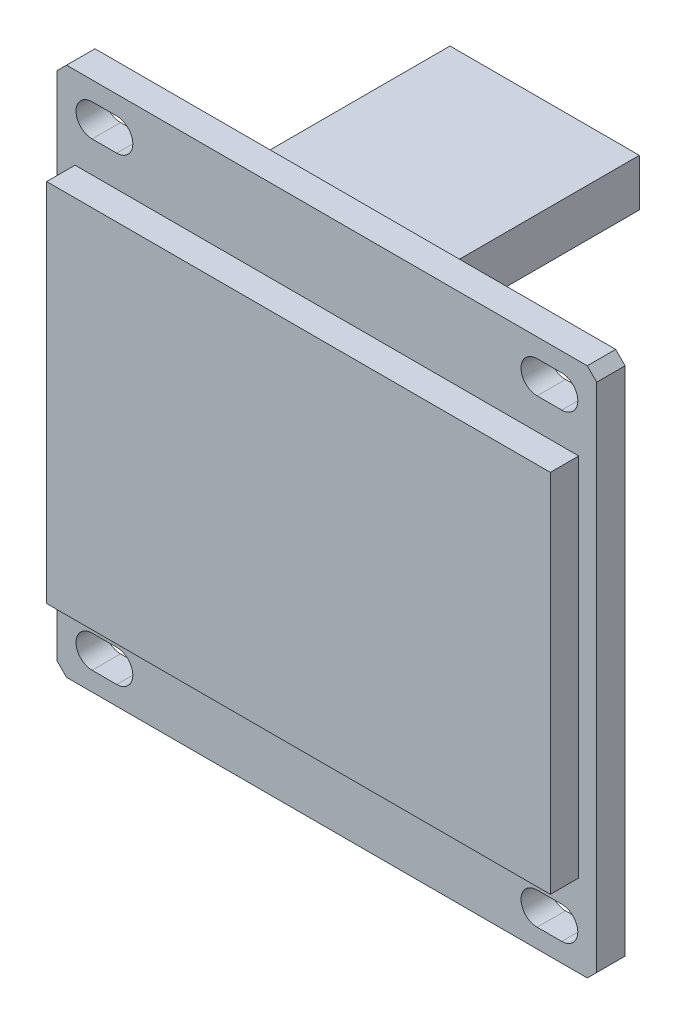
ISO-10303-21;
HEADER;
FILE_DESCRIPTION(('STEP AP214'),'2;1');
FILE_NAME('part.step','',(''),(''),'','','');
FILE_SCHEMA(('AUTOMOTIVE_DESIGN { 1 0 10303 214 1 1 1 1 }'));
ENDSEC;
DATA;
#1=APPLICATION_CONTEXT('core data for automotive mechanical design processes');
#2=APPLICATION_PROTOCOL_DEFINITION('international standard','automotive_design',2000,#1);
#3=PRODUCT_CONTEXT('',#1,'mechanical');
#4=PRODUCT('Part','Part','',(#3));
#5=PRODUCT_RELATED_PRODUCT_CATEGORY('part','',(#4));
#6=PRODUCT_DEFINITION_FORMATION('','',#4);
#7=PRODUCT_DEFINITION_CONTEXT('part definition',#1,'design');
#8=PRODUCT_DEFINITION('design','',#6,#7);
#9=PRODUCT_DEFINITION_SHAPE('','',#8);
#10=(LENGTH_UNIT() NAMED_UNIT(*) SI_UNIT(.MILLI.,.METRE.));
#11=(NAMED_UNIT(*) PLANE_ANGLE_UNIT() SI_UNIT($,.RADIAN.));
#12=(NAMED_UNIT(*) SI_UNIT($,.STERADIAN.) SOLID_ANGLE_UNIT());
#13=UNCERTAINTY_MEASURE_WITH_UNIT(LENGTH_MEASURE(1.E-05),#10,'distance_accuracy_value','');
#14=(GEOMETRIC_REPRESENTATION_CONTEXT(3) GLOBAL_UNCERTAINTY_ASSIGNED_CONTEXT((#13)) GLOBAL_UNIT_ASSIGNED_CONTEXT((#10,
#11,#12)) REPRESENTATION_CONTEXT('',''));
#15=CARTESIAN_POINT('',(0.,0.,0.));
#16=DIRECTION('',(0.,0.,1.));
#17=DIRECTION('',(1.,0.,0.));
#18=AXIS2_PLACEMENT_3D('',#15,#16,#17);
#19=CARTESIAN_POINT('',(0.,0.,0.));
#20=DIRECTION('',(0.,0.,-1.));
#21=DIRECTION('',(-1.,0.,0.));
#22=AXIS2_PLACEMENT_3D('',#19,#20,#21);
#23=PLANE('',#22);
#24=DIRECTION('',(-0.707106781186545,-0.70710678118655,0.));
#25=VECTOR('',#24,1.);
#26=CARTESIAN_POINT('',(-29.4344801548384,-36.0074440446685,0.));
#27=LINE('',#26,#25);
#28=CARTESIAN_POINT('',(-28.9344801548384,-35.5074440446685,0.));
#29=VERTEX_POINT('',#28);
#30=CARTESIAN_POINT('',(-29.4344801548384,-36.0074440446685,0.));
#31=VERTEX_POINT('',#30);
#32=EDGE_CURVE('E425',#29,#31,#27,.T.);
#33=ORIENTED_EDGE('',*,*,#32,.F.);
#34=DIRECTION('',(-1.,0.,0.));
#35=VECTOR('',#34,1.);
#36=CARTESIAN_POINT('',(-28.9344801548384,-35.5074440446685,0.));
#37=LINE('',#36,#35);
#38=CARTESIAN_POINT('',(-1.43448015483836,-35.5074440446685,0.));
#39=VERTEX_POINT('',#38);
#40=EDGE_CURVE('E430',#39,#29,#37,.T.);
#41=ORIENTED_EDGE('',*,*,#40,.F.);
#42=DIRECTION('',(-0.707106781186547,0.707106781186548,0.));
#43=VECTOR('',#42,1.);
#44=CARTESIAN_POINT('',(-1.43448015483836,-35.5074440446685,0.));
#45=LINE('',#44,#43);
#46=CARTESIAN_POINT('',(-0.934480154838363,-36.0074440446685,0.));
#47=VERTEX_POINT('',#46);
#48=EDGE_CURVE('E457',#47,#39,#45,.T.);
#49=ORIENTED_EDGE('',*,*,#48,.F.);
#50=DIRECTION('',(0.,1.,0.));
#51=VECTOR('',#50,1.);
#52=CARTESIAN_POINT('',(-0.934480154838363,-36.0074440446685,0.));
#53=LINE('',#52,#51);
#54=CARTESIAN_POINT('',(-0.93448015483836,-63.0074440446685,0.));
#55=VERTEX_POINT('',#54);
#56=EDGE_CURVE('E455',#55,#47,#53,.T.);
#57=ORIENTED_EDGE('',*,*,#56,.F.);
#58=DIRECTION('',(0.707106781186548,0.707106781186547,0.));
#59=VECTOR('',#58,1.);
#60=CARTESIAN_POINT('',(-1.43448015483836,-63.5074440446685,0.));
#61=LINE('',#60,#59);
#62=CARTESIAN_POINT('',(-1.43448015483836,-63.5074440446685,0.));
#63=VERTEX_POINT('',#62);
#64=EDGE_CURVE('E453',#63,#55,#61,.T.);
#65=ORIENTED_EDGE('',*,*,#64,.F.);
#66=DIRECTION('',(1.,0.,0.));
#67=VECTOR('',#66,1.);
#68=CARTESIAN_POINT('',(-28.9344801548384,-63.5074440446685,0.));
#69=LINE('',#68,#67);
#70=CARTESIAN_POINT('',(-28.9344801548384,-63.5074440446685,0.));
#71=VERTEX_POINT('',#70);
#72=EDGE_CURVE('E451',#71,#63,#69,.T.);
#73=ORIENTED_EDGE('',*,*,#72,.F.);
#74=DIRECTION('',(0.707106781186547,-0.707106781186547,0.));
#75=VECTOR('',#74,1.);
#76=CARTESIAN_POINT('',(-29.4344801548384,-63.0074440446685,0.));
#77=LINE('',#76,#75);
#78=CARTESIAN_POINT('',(-29.4344801548384,-63.0074440446685,0.));
#79=VERTEX_POINT('',#78);
#80=EDGE_CURVE('E449',#79,#71,#77,.T.);
#81=ORIENTED_EDGE('',*,*,#80,.F.);
#82=DIRECTION('',(0.,-1.,0.));
#83=VECTOR('',#82,1.);
#84=CARTESIAN_POINT('',(-29.4344801548384,-36.0074440446685,0.));
#85=LINE('',#84,#83);
#86=EDGE_CURVE('E447',#31,#79,#85,.T.);
#87=ORIENTED_EDGE('',*,*,#86,.F.);
#88=EDGE_LOOP('',(#33,#41,#49,#57,#65,#73,#81,#87));
#89=FACE_BOUND('',#88,.T.);
#90=DIRECTION('',(-1.,0.,0.));
#91=VECTOR('',#90,1.);
#92=CARTESIAN_POINT('',(-4.08448015483837,-36.5074440446685,0.));
#93=LINE('',#92,#91);
#94=CARTESIAN_POINT('',(-2.78448015483836,-36.5074440446685,0.));
#95=VERTEX_POINT('',#94);
#96=CARTESIAN_POINT('',(-4.08448015483837,-36.5074440446685,0.));
#97=VERTEX_POINT('',#96);
#98=EDGE_CURVE('E398',#95,#97,#93,.T.);
#99=ORIENTED_EDGE('',*,*,#98,.T.);
#100=CARTESIAN_POINT('',(-4.08448015483837,-37.3574440446685,0.));
#101=DIRECTION('',(0.,0.,1.));
#102=DIRECTION('',(1.,0.,0.));
#103=AXIS2_PLACEMENT_3D('',#100,#101,#102);
#104=CIRCLE('',#103,0.849999999999997);
#105=CARTESIAN_POINT('',(-4.08448015483837,-38.2074440446685,0.));
#106=VERTEX_POINT('',#105);
#107=EDGE_CURVE('E394',#97,#106,#104,.T.);
#108=ORIENTED_EDGE('',*,*,#107,.T.);
#109=DIRECTION('',(1.,0.,0.));
#110=VECTOR('',#109,1.);
#111=CARTESIAN_POINT('',(-4.08448015483837,-38.2074440446685,0.));
#112=LINE('',#111,#110);
#113=CARTESIAN_POINT('',(-2.78448015483836,-38.2074440446685,0.));
#114=VERTEX_POINT('',#113);
#115=EDGE_CURVE('E408',#106,#114,#112,.T.);
#116=ORIENTED_EDGE('',*,*,#115,.T.);
#117=CARTESIAN_POINT('',(-2.78448015483836,-37.3574440446685,0.));
#118=DIRECTION('',(0.,0.,1.));
#119=DIRECTION('',(1.,0.,0.));
#120=AXIS2_PLACEMENT_3D('',#117,#118,#119);
#121=CIRCLE('',#120,0.84999999999999);
#122=EDGE_CURVE('E411',#114,#95,#121,.T.);
#123=ORIENTED_EDGE('',*,*,#122,.T.);
#124=EDGE_LOOP('',(#99,#108,#116,#123));
#125=FACE_BOUND('',#124,.T.);
#126=DIRECTION('',(-1.,0.,0.));
#127=VECTOR('',#126,1.);
#128=CARTESIAN_POINT('',(-27.5844801548384,-36.5074440446685,0.));
#129=LINE('',#128,#127);
#130=CARTESIAN_POINT('',(-26.2844801548384,-36.5074440446685,0.));
#131=VERTEX_POINT('',#130);
#132=CARTESIAN_POINT('',(-27.5844801548384,-36.5074440446685,0.));
#133=VERTEX_POINT('',#132);
#134=EDGE_CURVE('E367',#131,#133,#129,.T.);
#135=ORIENTED_EDGE('',*,*,#134,.T.);
#136=CARTESIAN_POINT('',(-27.5844801548384,-37.3574440446685,0.));
#137=DIRECTION('',(0.,0.,1.));
#138=DIRECTION('',(1.,0.,0.));
#139=AXIS2_PLACEMENT_3D('',#136,#137,#138);
#140=CIRCLE('',#139,0.849999999999983);
#141=CARTESIAN_POINT('',(-27.5844801548384,-38.2074440446684,0.));
#142=VERTEX_POINT('',#141);
#143=EDGE_CURVE('E363',#133,#142,#140,.T.);
#144=ORIENTED_EDGE('',*,*,#143,.T.);
#145=DIRECTION('',(1.,0.,0.));
#146=VECTOR('',#145,1.);
#147=CARTESIAN_POINT('',(-27.5844801548384,-38.2074440446684,0.));
#148=LINE('',#147,#146);
#149=CARTESIAN_POINT('',(-26.2844801548384,-38.2074440446684,0.));
#150=VERTEX_POINT('',#149);
#151=EDGE_CURVE('E377',#142,#150,#148,.T.);
#152=ORIENTED_EDGE('',*,*,#151,.T.);
#153=CARTESIAN_POINT('',(-26.2844801548384,-37.3574440446685,0.));
#154=DIRECTION('',(0.,0.,1.));
#155=DIRECTION('',(1.,0.,0.));
#156=AXIS2_PLACEMENT_3D('',#153,#154,#155);
#157=CIRCLE('',#156,0.849999999999983);
#158=EDGE_CURVE('E380',#150,#131,#157,.T.);
#159=ORIENTED_EDGE('',*,*,#158,.T.);
#160=EDGE_LOOP('',(#135,#144,#152,#159));
#161=FACE_BOUND('',#160,.T.);
#162=DIRECTION('',(-1.,0.,0.));
#163=VECTOR('',#162,1.);
#164=CARTESIAN_POINT('',(-27.5844801548383,-60.8074440446684,0.));
#165=LINE('',#164,#163);
#166=CARTESIAN_POINT('',(-26.2844801548384,-60.8074440446684,0.));
#167=VERTEX_POINT('',#166);
#168=CARTESIAN_POINT('',(-27.5844801548383,-60.8074440446684,0.));
#169=VERTEX_POINT('',#168);
#170=EDGE_CURVE('E336',#167,#169,#165,.T.);
#171=ORIENTED_EDGE('',*,*,#170,.T.);
#172=CARTESIAN_POINT('',(-27.5844801548383,-61.6574440446684,0.));
#173=DIRECTION('',(0.,0.,1.));
#174=DIRECTION('',(1.,0.,0.));
#175=AXIS2_PLACEMENT_3D('',#172,#173,#174);
#176=CIRCLE('',#175,0.850000000000024);
#177=CARTESIAN_POINT('',(-27.5844801548383,-62.5074440446685,0.));
#178=VERTEX_POINT('',#177);
#179=EDGE_CURVE('E332',#169,#178,#176,.T.);
#180=ORIENTED_EDGE('',*,*,#179,.T.);
#181=DIRECTION('',(1.,0.,0.));
#182=VECTOR('',#181,1.);
#183=CARTESIAN_POINT('',(-27.5844801548383,-62.5074440446685,0.));
#184=LINE('',#183,#182);
#185=CARTESIAN_POINT('',(-26.2844801548384,-62.5074440446685,0.));
#186=VERTEX_POINT('',#185);
#187=EDGE_CURVE('E346',#178,#186,#184,.T.);
#188=ORIENTED_EDGE('',*,*,#187,.T.);
#189=CARTESIAN_POINT('',(-26.2844801548384,-61.6574440446685,0.));
#190=DIRECTION('',(0.,0.,1.));
#191=DIRECTION('',(1.,0.,0.));
#192=AXIS2_PLACEMENT_3D('',#189,#190,#191);
#193=CIRCLE('',#192,0.850000000000024);
#194=EDGE_CURVE('E349',#186,#167,#193,.T.);
#195=ORIENTED_EDGE('',*,*,#194,.T.);
#196=EDGE_LOOP('',(#171,#180,#188,#195));
#197=FACE_BOUND('',#196,.T.);
#198=DIRECTION('',(-1.,0.,0.));
#199=VECTOR('',#198,1.);
#200=CARTESIAN_POINT('',(-4.08448015483836,-60.8074440446684,0.));
#201=LINE('',#200,#199);
#202=CARTESIAN_POINT('',(-2.78448015483838,-60.8074440446684,0.));
#203=VERTEX_POINT('',#202);
#204=CARTESIAN_POINT('',(-4.08448015483836,-60.8074440446684,0.));
#205=VERTEX_POINT('',#204);
#206=EDGE_CURVE('E305',#203,#205,#201,.T.);
#207=ORIENTED_EDGE('',*,*,#206,.T.);
#208=CARTESIAN_POINT('',(-4.08448015483836,-61.6574440446685,0.));
#209=DIRECTION('',(0.,0.,1.));
#210=DIRECTION('',(1.,0.,0.));
#211=AXIS2_PLACEMENT_3D('',#208,#209,#210);
#212=CIRCLE('',#211,0.850000000000017);
#213=CARTESIAN_POINT('',(-4.08448015483836,-62.5074440446685,0.));
#214=VERTEX_POINT('',#213);
#215=EDGE_CURVE('E301',#205,#214,#212,.T.);
#216=ORIENTED_EDGE('',*,*,#215,.T.);
#217=DIRECTION('',(1.,0.,0.));
#218=VECTOR('',#217,1.);
#219=CARTESIAN_POINT('',(-4.08448015483836,-62.5074440446685,0.));
#220=LINE('',#219,#218);
#221=CARTESIAN_POINT('',(-2.78448015483838,-62.5074440446685,0.));
#222=VERTEX_POINT('',#221);
#223=EDGE_CURVE('E315',#214,#222,#220,.T.);
#224=ORIENTED_EDGE('',*,*,#223,.T.);
#225=CARTESIAN_POINT('',(-2.78448015483838,-61.6574440446685,0.));
#226=DIRECTION('',(0.,0.,1.));
#227=DIRECTION('',(1.,0.,0.));
#228=AXIS2_PLACEMENT_3D('',#225,#226,#227);
#229=CIRCLE('',#228,0.850000000000017);
#230=EDGE_CURVE('E318',#222,#203,#229,.T.);
#231=ORIENTED_EDGE('',*,*,#230,.T.);
#232=EDGE_LOOP('',(#207,#216,#224,#231));
#233=FACE_BOUND('',#232,.T.);
#234=DIRECTION('',(1.,0.,0.));
#235=VECTOR('',#234,1.);
#236=CARTESIAN_POINT('',(-20.1844801548384,-36.0074440446685,0.));
#237=LINE('',#236,#235);
#238=CARTESIAN_POINT('',(-20.1844801548384,-36.0074440446685,0.));
#239=VERTEX_POINT('',#238);
#240=CARTESIAN_POINT('',(-10.1844801548384,-36.0074440446685,0.));
#241=VERTEX_POINT('',#240);
#242=EDGE_CURVE('E858',#239,#241,#237,.T.);
#243=ORIENTED_EDGE('',*,*,#242,.F.);
#244=DIRECTION('',(0.,1.,0.));
#245=VECTOR('',#244,1.);
#246=CARTESIAN_POINT('',(-20.1844801548384,-38.5074440446685,0.));
#247=LINE('',#246,#245);
#248=CARTESIAN_POINT('',(-20.1844801548384,-38.5074440446685,0.));
#249=VERTEX_POINT('',#248);
#250=EDGE_CURVE('E265',#249,#239,#247,.T.);
#251=ORIENTED_EDGE('',*,*,#250,.F.);
#252=DIRECTION('',(-1.,0.,0.));
#253=VECTOR('',#252,1.);
#254=CARTESIAN_POINT('',(-20.1844801548384,-38.5074440446685,0.));
#255=LINE('',#254,#253);
#256=CARTESIAN_POINT('',(-10.1844801548384,-38.5074440446685,0.));
#257=VERTEX_POINT('',#256);
#258=EDGE_CURVE('E261',#257,#249,#255,.T.);
#259=ORIENTED_EDGE('',*,*,#258,.F.);
#260=DIRECTION('',(0.,-1.,0.));
#261=VECTOR('',#260,1.);
#262=CARTESIAN_POINT('',(-10.1844801548384,-38.5074440446685,0.));
#263=LINE('',#262,#261);
#264=EDGE_CURVE('E855',#241,#257,#263,.T.);
#265=ORIENTED_EDGE('',*,*,#264,.F.);
#266=EDGE_LOOP('',(#243,#251,#259,#265));
#267=FACE_BOUND('',#266,.T.);
#268=ADVANCED_FACE('F33',(#89,#125,#161,#197,#233,#267),#23,.T.);
#269=CARTESIAN_POINT('',(0.,0.,1.5));
#270=DIRECTION('',(0.,0.,-1.));
#271=DIRECTION('',(-1.,0.,0.));
#272=AXIS2_PLACEMENT_3D('',#269,#270,#271);
#273=PLANE('',#272);
#274=CARTESIAN_POINT('',(-4.08448015483836,-61.6574440446685,1.5));
#275=DIRECTION('',(0.,0.,1.));
#276=DIRECTION('',(1.,0.,0.));
#277=AXIS2_PLACEMENT_3D('',#274,#275,#276);
#278=CIRCLE('',#277,0.850000000000017);
#279=CARTESIAN_POINT('',(-4.08448015483836,-60.8074440446684,1.5));
#280=VERTEX_POINT('',#279);
#281=CARTESIAN_POINT('',(-4.08448015483836,-62.5074440446685,1.5));
#282=VERTEX_POINT('',#281);
#283=EDGE_CURVE('E302',#280,#282,#278,.T.);
#284=ORIENTED_EDGE('',*,*,#283,.F.);
#285=DIRECTION('',(-1.,0.,0.));
#286=VECTOR('',#285,1.);
#287=CARTESIAN_POINT('',(-4.08448015483836,-60.8074440446684,1.5));
#288=LINE('',#287,#286);
#289=CARTESIAN_POINT('',(-2.78448015483838,-60.8074440446684,1.5));
#290=VERTEX_POINT('',#289);
#291=EDGE_CURVE('E310',#290,#280,#288,.T.);
#292=ORIENTED_EDGE('',*,*,#291,.F.);
#293=CARTESIAN_POINT('',(-2.78448015483838,-61.6574440446685,1.5));
#294=DIRECTION('',(0.,0.,1.));
#295=DIRECTION('',(1.,0.,0.));
#296=AXIS2_PLACEMENT_3D('',#293,#294,#295);
#297=CIRCLE('',#296,0.850000000000017);
#298=CARTESIAN_POINT('',(-2.78448015483838,-62.5074440446685,1.5));
#299=VERTEX_POINT('',#298);
#300=EDGE_CURVE('E307',#299,#290,#297,.T.);
#301=ORIENTED_EDGE('',*,*,#300,.F.);
#302=DIRECTION('',(1.,0.,0.));
#303=VECTOR('',#302,1.);
#304=CARTESIAN_POINT('',(-4.08448015483836,-62.5074440446685,1.5));
#305=LINE('',#304,#303);
#306=EDGE_CURVE('E304',#282,#299,#305,.T.);
#307=ORIENTED_EDGE('',*,*,#306,.F.);
#308=EDGE_LOOP('',(#284,#292,#301,#307));
#309=FACE_BOUND('',#308,.T.);
#310=CARTESIAN_POINT('',(-27.5844801548384,-37.3574440446685,1.5));
#311=DIRECTION('',(0.,0.,1.));
#312=DIRECTION('',(1.,0.,0.));
#313=AXIS2_PLACEMENT_3D('',#310,#311,#312);
#314=CIRCLE('',#313,0.849999999999983);
#315=CARTESIAN_POINT('',(-27.5844801548384,-36.5074440446685,1.5));
#316=VERTEX_POINT('',#315);
#317=CARTESIAN_POINT('',(-27.5844801548384,-38.2074440446684,1.5));
#318=VERTEX_POINT('',#317);
#319=EDGE_CURVE('E364',#316,#318,#314,.T.);
#320=ORIENTED_EDGE('',*,*,#319,.F.);
#321=DIRECTION('',(-1.,0.,0.));
#322=VECTOR('',#321,1.);
#323=CARTESIAN_POINT('',(-27.5844801548384,-36.5074440446685,1.5));
#324=LINE('',#323,#322);
#325=CARTESIAN_POINT('',(-26.2844801548384,-36.5074440446685,1.5));
#326=VERTEX_POINT('',#325);
#327=EDGE_CURVE('E372',#326,#316,#324,.T.);
#328=ORIENTED_EDGE('',*,*,#327,.F.);
#329=CARTESIAN_POINT('',(-26.2844801548384,-37.3574440446685,1.5));
#330=DIRECTION('',(0.,0.,1.));
#331=DIRECTION('',(1.,0.,0.));
#332=AXIS2_PLACEMENT_3D('',#329,#330,#331);
#333=CIRCLE('',#332,0.849999999999983);
#334=CARTESIAN_POINT('',(-26.2844801548384,-38.2074440446684,1.5));
#335=VERTEX_POINT('',#334);
#336=EDGE_CURVE('E369',#335,#326,#333,.T.);
#337=ORIENTED_EDGE('',*,*,#336,.F.);
#338=DIRECTION('',(1.,0.,0.));
#339=VECTOR('',#338,1.);
#340=CARTESIAN_POINT('',(-27.5844801548384,-38.2074440446684,1.5));
#341=LINE('',#340,#339);
#342=EDGE_CURVE('E366',#318,#335,#341,.T.);
#343=ORIENTED_EDGE('',*,*,#342,.F.);
#344=EDGE_LOOP('',(#320,#328,#337,#343));
#345=FACE_BOUND('',#344,.T.);
#346=DIRECTION('',(-0.707106781186545,-0.70710678118655,0.));
#347=VECTOR('',#346,1.);
#348=CARTESIAN_POINT('',(-29.4344801548384,-36.0074440446685,1.5));
#349=LINE('',#348,#347);
#350=CARTESIAN_POINT('',(-28.9344801548384,-35.5074440446685,1.5));
#351=VERTEX_POINT('',#350);
#352=CARTESIAN_POINT('',(-29.4344801548384,-36.0074440446685,1.5));
#353=VERTEX_POINT('',#352);
#354=EDGE_CURVE('E426',#351,#353,#349,.T.);
#355=ORIENTED_EDGE('',*,*,#354,.T.);
#356=DIRECTION('',(0.,-1.,0.));
#357=VECTOR('',#356,1.);
#358=CARTESIAN_POINT('',(-29.4344801548384,-36.0074440446685,1.5));
#359=LINE('',#358,#357);
#360=CARTESIAN_POINT('',(-29.4344801548384,-63.0074440446685,1.5));
#361=VERTEX_POINT('',#360);
#362=EDGE_CURVE('E429',#353,#361,#359,.T.);
#363=ORIENTED_EDGE('',*,*,#362,.T.);
#364=DIRECTION('',(0.707106781186547,-0.707106781186547,0.));
#365=VECTOR('',#364,1.);
#366=CARTESIAN_POINT('',(-29.4344801548384,-63.0074440446685,1.5));
#367=LINE('',#366,#365);
#368=CARTESIAN_POINT('',(-28.9344801548384,-63.5074440446685,1.5));
#369=VERTEX_POINT('',#368);
#370=EDGE_CURVE('E432',#361,#369,#367,.T.);
#371=ORIENTED_EDGE('',*,*,#370,.T.);
#372=DIRECTION('',(1.,0.,0.));
#373=VECTOR('',#372,1.);
#374=CARTESIAN_POINT('',(-28.9344801548384,-63.5074440446685,1.5));
#375=LINE('',#374,#373);
#376=CARTESIAN_POINT('',(-1.43448015483836,-63.5074440446685,1.5));
#377=VERTEX_POINT('',#376);
#378=EDGE_CURVE('E434',#369,#377,#375,.T.);
#379=ORIENTED_EDGE('',*,*,#378,.T.);
#380=DIRECTION('',(0.707106781186548,0.707106781186547,0.));
#381=VECTOR('',#380,1.);
#382=CARTESIAN_POINT('',(-1.43448015483836,-63.5074440446685,1.5));
#383=LINE('',#382,#381);
#384=CARTESIAN_POINT('',(-0.93448015483836,-63.0074440446685,1.5));
#385=VERTEX_POINT('',#384);
#386=EDGE_CURVE('E436',#377,#385,#383,.T.);
#387=ORIENTED_EDGE('',*,*,#386,.T.);
#388=DIRECTION('',(0.,1.,0.));
#389=VECTOR('',#388,1.);
#390=CARTESIAN_POINT('',(-0.934480154838363,-36.0074440446685,1.5));
#391=LINE('',#390,#389);
#392=CARTESIAN_POINT('',(-0.934480154838363,-36.0074440446685,1.5));
#393=VERTEX_POINT('',#392);
#394=EDGE_CURVE('E438',#385,#393,#391,.T.);
#395=ORIENTED_EDGE('',*,*,#394,.T.);
#396=DIRECTION('',(-0.707106781186547,0.707106781186548,0.));
#397=VECTOR('',#396,1.);
#398=CARTESIAN_POINT('',(-1.43448015483836,-35.5074440446685,1.5));
#399=LINE('',#398,#397);
#400=CARTESIAN_POINT('',(-1.43448015483836,-35.5074440446685,1.5));
#401=VERTEX_POINT('',#400);
#402=EDGE_CURVE('E440',#393,#401,#399,.T.);
#403=ORIENTED_EDGE('',*,*,#402,.T.);
#404=DIRECTION('',(-1.,0.,0.));
#405=VECTOR('',#404,1.);
#406=CARTESIAN_POINT('',(-28.9344801548384,-35.5074440446685,1.5));
#407=LINE('',#406,#405);
#408=EDGE_CURVE('E442',#401,#351,#407,.T.);
#409=ORIENTED_EDGE('',*,*,#408,.T.);
#410=EDGE_LOOP('',(#355,#363,#371,#379,#387,#395,#403,#409));
#411=FACE_BOUND('',#410,.T.);
#412=CARTESIAN_POINT('',(-4.08448015483837,-37.3574440446685,1.5));
#413=DIRECTION('',(0.,0.,1.));
#414=DIRECTION('',(1.,0.,0.));
#415=AXIS2_PLACEMENT_3D('',#412,#413,#414);
#416=CIRCLE('',#415,0.849999999999997);
#417=CARTESIAN_POINT('',(-4.08448015483837,-36.5074440446685,1.5));
#418=VERTEX_POINT('',#417);
#419=CARTESIAN_POINT('',(-4.08448015483837,-38.2074440446685,1.5));
#420=VERTEX_POINT('',#419);
#421=EDGE_CURVE('E395',#418,#420,#416,.T.);
#422=ORIENTED_EDGE('',*,*,#421,.F.);
#423=DIRECTION('',(-1.,0.,0.));
#424=VECTOR('',#423,1.);
#425=CARTESIAN_POINT('',(-4.08448015483837,-36.5074440446685,1.5));
#426=LINE('',#425,#424);
#427=CARTESIAN_POINT('',(-2.78448015483836,-36.5074440446685,1.5));
#428=VERTEX_POINT('',#427);
#429=EDGE_CURVE('E403',#428,#418,#426,.T.);
#430=ORIENTED_EDGE('',*,*,#429,.F.);
#431=CARTESIAN_POINT('',(-2.78448015483836,-37.3574440446685,1.5));
#432=DIRECTION('',(0.,0.,1.));
#433=DIRECTION('',(1.,0.,0.));
#434=AXIS2_PLACEMENT_3D('',#431,#432,#433);
#435=CIRCLE('',#434,0.84999999999999);
#436=CARTESIAN_POINT('',(-2.78448015483836,-38.2074440446685,1.5));
#437=VERTEX_POINT('',#436);
#438=EDGE_CURVE('E400',#437,#428,#435,.T.);
#439=ORIENTED_EDGE('',*,*,#438,.F.);
#440=DIRECTION('',(1.,0.,0.));
#441=VECTOR('',#440,1.);
#442=CARTESIAN_POINT('',(-4.08448015483837,-38.2074440446685,1.5));
#443=LINE('',#442,#441);
#444=EDGE_CURVE('E397',#420,#437,#443,.T.);
#445=ORIENTED_EDGE('',*,*,#444,.F.);
#446=EDGE_LOOP('',(#422,#430,#439,#445));
#447=FACE_BOUND('',#446,.T.);
#448=CARTESIAN_POINT('',(-27.5844801548383,-61.6574440446684,1.5));
#449=DIRECTION('',(0.,0.,1.));
#450=DIRECTION('',(1.,0.,0.));
#451=AXIS2_PLACEMENT_3D('',#448,#449,#450);
#452=CIRCLE('',#451,0.850000000000024);
#453=CARTESIAN_POINT('',(-27.5844801548383,-60.8074440446684,1.5));
#454=VERTEX_POINT('',#453);
#455=CARTESIAN_POINT('',(-27.5844801548383,-62.5074440446685,1.5));
#456=VERTEX_POINT('',#455);
#457=EDGE_CURVE('E333',#454,#456,#452,.T.);
#458=ORIENTED_EDGE('',*,*,#457,.F.);
#459=DIRECTION('',(-1.,0.,0.));
#460=VECTOR('',#459,1.);
#461=CARTESIAN_POINT('',(-27.5844801548383,-60.8074440446684,1.5));
#462=LINE('',#461,#460);
#463=CARTESIAN_POINT('',(-26.2844801548384,-60.8074440446684,1.5));
#464=VERTEX_POINT('',#463);
#465=EDGE_CURVE('E341',#464,#454,#462,.T.);
#466=ORIENTED_EDGE('',*,*,#465,.F.);
#467=CARTESIAN_POINT('',(-26.2844801548384,-61.6574440446685,1.5));
#468=DIRECTION('',(0.,0.,1.));
#469=DIRECTION('',(1.,0.,0.));
#470=AXIS2_PLACEMENT_3D('',#467,#468,#469);
#471=CIRCLE('',#470,0.850000000000024);
#472=CARTESIAN_POINT('',(-26.2844801548384,-62.5074440446685,1.5));
#473=VERTEX_POINT('',#472);
#474=EDGE_CURVE('E338',#473,#464,#471,.T.);
#475=ORIENTED_EDGE('',*,*,#474,.F.);
#476=DIRECTION('',(1.,0.,0.));
#477=VECTOR('',#476,1.);
#478=CARTESIAN_POINT('',(-27.5844801548383,-62.5074440446685,1.5));
#479=LINE('',#478,#477);
#480=EDGE_CURVE('E335',#456,#473,#479,.T.);
#481=ORIENTED_EDGE('',*,*,#480,.F.);
#482=EDGE_LOOP('',(#458,#466,#475,#481));
#483=FACE_BOUND('',#482,.T.);
#484=DIRECTION('',(0.,-1.,0.));
#485=VECTOR('',#484,1.);
#486=CARTESIAN_POINT('',(-28.4844801548384,-39.8574440446684,1.5));
#487=LINE('',#486,#485);
#488=CARTESIAN_POINT('',(-28.4844801548384,-39.8574440446684,1.5));
#489=VERTEX_POINT('',#488);
#490=CARTESIAN_POINT('',(-28.4844801548384,-59.1574440446685,1.5));
#491=VERTEX_POINT('',#490);
#492=EDGE_CURVE('E267',#489,#491,#487,.T.);
#493=ORIENTED_EDGE('',*,*,#492,.F.);
#494=DIRECTION('',(-1.,0.,0.));
#495=VECTOR('',#494,1.);
#496=CARTESIAN_POINT('',(-28.4844801548384,-39.8574440446684,1.5));
#497=LINE('',#496,#495);
#498=CARTESIAN_POINT('',(-1.88448015483836,-39.8574440446684,1.5));
#499=VERTEX_POINT('',#498);
#500=EDGE_CURVE('E278',#499,#489,#497,.T.);
#501=ORIENTED_EDGE('',*,*,#500,.F.);
#502=DIRECTION('',(0.,1.,0.));
#503=VECTOR('',#502,1.);
#504=CARTESIAN_POINT('',(-1.88448015483836,-39.8574440446684,1.5));
#505=LINE('',#504,#503);
#506=CARTESIAN_POINT('',(-1.88448015483836,-59.1574440446685,1.5));
#507=VERTEX_POINT('',#506);
#508=EDGE_CURVE('E286',#507,#499,#505,.T.);
#509=ORIENTED_EDGE('',*,*,#508,.F.);
#510=DIRECTION('',(1.,0.,0.));
#511=VECTOR('',#510,1.);
#512=CARTESIAN_POINT('',(-28.4844801548384,-59.1574440446685,1.5));
#513=LINE('',#512,#511);
#514=EDGE_CURVE('E56',#491,#507,#513,.T.);
#515=ORIENTED_EDGE('',*,*,#514,.F.);
#516=EDGE_LOOP('',(#493,#501,#509,#515));
#517=FACE_BOUND('',#516,.T.);
#518=ADVANCED_FACE('F500',(#309,#345,#411,#447,#483,#517),#273,.F.);
#519=CARTESIAN_POINT('',(-29.4344801548384,-36.0074440446685,1.5));
#520=DIRECTION('',(0.70710678118655,-0.707106781186545,0.));
#521=DIRECTION('',(0.707106781186545,0.70710678118655,0.));
#522=AXIS2_PLACEMENT_3D('',#519,#520,#521);
#523=PLANE('',#522);
#524=ORIENTED_EDGE('',*,*,#32,.T.);
#525=DIRECTION('',(0.,0.,-1.));
#526=VECTOR('',#525,1.);
#527=CARTESIAN_POINT('',(-29.4344801548384,-36.0074440446685,1.5));
#528=LINE('',#527,#526);
#529=EDGE_CURVE('E11',#353,#31,#528,.T.);
#530=ORIENTED_EDGE('',*,*,#529,.F.);
#531=ORIENTED_EDGE('',*,*,#354,.F.);
#532=DIRECTION('',(0.,0.,-1.));
#533=VECTOR('',#532,1.);
#534=CARTESIAN_POINT('',(-28.9344801548384,-35.5074440446685,1.5));
#535=LINE('',#534,#533);
#536=EDGE_CURVE('E444',#351,#29,#535,.T.);
#537=ORIENTED_EDGE('',*,*,#536,.T.);
#538=EDGE_LOOP('',(#524,#530,#531,#537));
#539=FACE_BOUND('',#538,.T.);
#540=ADVANCED_FACE('F35',(#539),#523,.F.);
#541=CARTESIAN_POINT('',(-29.4344801548384,-36.0074440446685,1.5));
#542=DIRECTION('',(1.,0.,0.));
#543=DIRECTION('',(0.,1.,0.));
#544=AXIS2_PLACEMENT_3D('',#541,#542,#543);
#545=PLANE('',#544);
#546=ORIENTED_EDGE('',*,*,#86,.T.);
#547=DIRECTION('',(0.,0.,-1.));
#548=VECTOR('',#547,1.);
#549=CARTESIAN_POINT('',(-29.4344801548384,-63.0074440446685,1.5));
#550=LINE('',#549,#548);
#551=EDGE_CURVE('E41',#361,#79,#550,.T.);
#552=ORIENTED_EDGE('',*,*,#551,.F.);
#553=ORIENTED_EDGE('',*,*,#362,.F.);
#554=ORIENTED_EDGE('',*,*,#529,.T.);
#555=EDGE_LOOP('',(#546,#552,#553,#554));
#556=FACE_BOUND('',#555,.T.);
#557=ADVANCED_FACE('F505',(#556),#545,.F.);
#558=CARTESIAN_POINT('',(-29.4344801548384,-63.0074440446685,1.5));
#559=DIRECTION('',(0.707106781186548,0.707106781186548,0.));
#560=DIRECTION('',(-0.707106781186548,0.707106781186548,0.));
#561=AXIS2_PLACEMENT_3D('',#558,#559,#560);
#562=PLANE('',#561);
#563=ORIENTED_EDGE('',*,*,#80,.T.);
#564=DIRECTION('',(0.,0.,-1.));
#565=VECTOR('',#564,1.);
#566=CARTESIAN_POINT('',(-28.9344801548384,-63.5074440446685,1.5));
#567=LINE('',#566,#565);
#568=EDGE_CURVE('E474',#369,#71,#567,.T.);
#569=ORIENTED_EDGE('',*,*,#568,.F.);
#570=ORIENTED_EDGE('',*,*,#370,.F.);
#571=ORIENTED_EDGE('',*,*,#551,.T.);
#572=EDGE_LOOP('',(#563,#569,#570,#571));
#573=FACE_BOUND('',#572,.T.);
#574=ADVANCED_FACE('F481',(#573),#562,.F.);
#575=CARTESIAN_POINT('',(-28.9344801548384,-63.5074440446685,1.5));
#576=DIRECTION('',(0.,1.,0.));
#577=DIRECTION('',(0.,0.,1.));
#578=AXIS2_PLACEMENT_3D('',#575,#576,#577);
#579=PLANE('',#578);
#580=ORIENTED_EDGE('',*,*,#72,.T.);
#581=DIRECTION('',(0.,0.,-1.));
#582=VECTOR('',#581,1.);
#583=CARTESIAN_POINT('',(-1.43448015483836,-63.5074440446685,1.5));
#584=LINE('',#583,#582);
#585=EDGE_CURVE('E471',#377,#63,#584,.T.);
#586=ORIENTED_EDGE('',*,*,#585,.F.);
#587=ORIENTED_EDGE('',*,*,#378,.F.);
#588=ORIENTED_EDGE('',*,*,#568,.T.);
#589=EDGE_LOOP('',(#580,#586,#587,#588));
#590=FACE_BOUND('',#589,.T.);
#591=ADVANCED_FACE('F492',(#590),#579,.F.);
#592=CARTESIAN_POINT('',(-1.43448015483836,-63.5074440446685,1.5));
#593=DIRECTION('',(-0.707106781186547,0.707106781186548,0.));
#594=DIRECTION('',(-0.707106781186548,-0.707106781186547,0.));
#595=AXIS2_PLACEMENT_3D('',#592,#593,#594);
#596=PLANE('',#595);
#597=ORIENTED_EDGE('',*,*,#64,.T.);
#598=DIRECTION('',(0.,0.,-1.));
#599=VECTOR('',#598,1.);
#600=CARTESIAN_POINT('',(-0.93448015483836,-63.0074440446685,1.5));
#601=LINE('',#600,#599);
#602=EDGE_CURVE('E468',#385,#55,#601,.T.);
#603=ORIENTED_EDGE('',*,*,#602,.F.);
#604=ORIENTED_EDGE('',*,*,#386,.F.);
#605=ORIENTED_EDGE('',*,*,#585,.T.);
#606=EDGE_LOOP('',(#597,#603,#604,#605));
#607=FACE_BOUND('',#606,.T.);
#608=ADVANCED_FACE('F496',(#607),#596,.F.);
#609=CARTESIAN_POINT('',(-0.934480154838363,-36.0074440446685,1.5));
#610=DIRECTION('',(-1.,0.,0.));
#611=DIRECTION('',(0.,-1.,0.));
#612=AXIS2_PLACEMENT_3D('',#609,#610,#611);
#613=PLANE('',#612);
#614=ORIENTED_EDGE('',*,*,#56,.T.);
#615=DIRECTION('',(0.,0.,-1.));
#616=VECTOR('',#615,1.);
#617=CARTESIAN_POINT('',(-0.934480154838363,-36.0074440446685,1.5));
#618=LINE('',#617,#616);
#619=EDGE_CURVE('E465',#393,#47,#618,.T.);
#620=ORIENTED_EDGE('',*,*,#619,.F.);
#621=ORIENTED_EDGE('',*,*,#394,.F.);
#622=ORIENTED_EDGE('',*,*,#602,.T.);
#623=EDGE_LOOP('',(#614,#620,#621,#622));
#624=FACE_BOUND('',#623,.T.);
#625=ADVANCED_FACE('F518',(#624),#613,.F.);
#626=CARTESIAN_POINT('',(-1.43448015483836,-35.5074440446685,1.5));
#627=DIRECTION('',(-0.707106781186548,-0.707106781186547,0.));
#628=DIRECTION('',(0.707106781186547,-0.707106781186548,0.));
#629=AXIS2_PLACEMENT_3D('',#626,#627,#628);
#630=PLANE('',#629);
#631=ORIENTED_EDGE('',*,*,#48,.T.);
#632=DIRECTION('',(0.,0.,-1.));
#633=VECTOR('',#632,1.);
#634=CARTESIAN_POINT('',(-1.43448015483836,-35.5074440446685,1.5));
#635=LINE('',#634,#633);
#636=EDGE_CURVE('E462',#401,#39,#635,.T.);
#637=ORIENTED_EDGE('',*,*,#636,.F.);
#638=ORIENTED_EDGE('',*,*,#402,.F.);
#639=ORIENTED_EDGE('',*,*,#619,.T.);
#640=EDGE_LOOP('',(#631,#637,#638,#639));
#641=FACE_BOUND('',#640,.T.);
#642=ADVANCED_FACE('F516',(#641),#630,.F.);
#643=CARTESIAN_POINT('',(-28.9344801548384,-35.5074440446685,1.5));
#644=DIRECTION('',(0.,-1.,0.));
#645=DIRECTION('',(0.,0.,-1.));
#646=AXIS2_PLACEMENT_3D('',#643,#644,#645);
#647=PLANE('',#646);
#648=ORIENTED_EDGE('',*,*,#40,.T.);
#649=ORIENTED_EDGE('',*,*,#536,.F.);
#650=ORIENTED_EDGE('',*,*,#408,.F.);
#651=ORIENTED_EDGE('',*,*,#636,.T.);
#652=EDGE_LOOP('',(#648,#649,#650,#651));
#653=FACE_BOUND('',#652,.T.);
#654=ADVANCED_FACE('F511',(#653),#647,.F.);
#655=CARTESIAN_POINT('',(-4.08448015483837,-37.3574440446685,1.5));
#656=DIRECTION('',(0.,0.,-1.));
#657=DIRECTION('',(-1.,0.,0.));
#658=AXIS2_PLACEMENT_3D('',#655,#656,#657);
#659=CYLINDRICAL_SURFACE('',#658,0.849999999999997);
#660=ORIENTED_EDGE('',*,*,#107,.F.);
#661=DIRECTION('',(0.,0.,-1.));
#662=VECTOR('',#661,1.);
#663=CARTESIAN_POINT('',(-4.08448015483837,-36.5074440446685,1.5));
#664=LINE('',#663,#662);
#665=EDGE_CURVE('E405',#418,#97,#664,.T.);
#666=ORIENTED_EDGE('',*,*,#665,.F.);
#667=ORIENTED_EDGE('',*,*,#421,.T.);
#668=DIRECTION('',(0.,0.,-1.));
#669=VECTOR('',#668,1.);
#670=CARTESIAN_POINT('',(-4.08448015483837,-38.2074440446685,1.5));
#671=LINE('',#670,#669);
#672=EDGE_CURVE('E422',#420,#106,#671,.T.);
#673=ORIENTED_EDGE('',*,*,#672,.T.);
#674=EDGE_LOOP('',(#660,#666,#667,#673));
#675=FACE_BOUND('',#674,.T.);
#676=ADVANCED_FACE('F537',(#675),#659,.F.);
#677=CARTESIAN_POINT('',(-4.08448015483837,-38.2074440446685,1.5));
#678=DIRECTION('',(0.,1.,0.));
#679=DIRECTION('',(0.,0.,1.));
#680=AXIS2_PLACEMENT_3D('',#677,#678,#679);
#681=PLANE('',#680);
#682=ORIENTED_EDGE('',*,*,#115,.F.);
#683=ORIENTED_EDGE('',*,*,#672,.F.);
#684=ORIENTED_EDGE('',*,*,#444,.T.);
#685=DIRECTION('',(0.,0.,-1.));
#686=VECTOR('',#685,1.);
#687=CARTESIAN_POINT('',(-2.78448015483836,-38.2074440446685,1.5));
#688=LINE('',#687,#686);
#689=EDGE_CURVE('E420',#437,#114,#688,.T.);
#690=ORIENTED_EDGE('',*,*,#689,.T.);
#691=EDGE_LOOP('',(#682,#683,#684,#690));
#692=FACE_BOUND('',#691,.T.);
#693=ADVANCED_FACE('F541',(#692),#681,.T.);
#694=CARTESIAN_POINT('',(-2.78448015483836,-37.3574440446685,1.5));
#695=DIRECTION('',(0.,0.,-1.));
#696=DIRECTION('',(-1.,0.,0.));
#697=AXIS2_PLACEMENT_3D('',#694,#695,#696);
#698=CYLINDRICAL_SURFACE('',#697,0.84999999999999);
#699=ORIENTED_EDGE('',*,*,#122,.F.);
#700=ORIENTED_EDGE('',*,*,#689,.F.);
#701=ORIENTED_EDGE('',*,*,#438,.T.);
#702=DIRECTION('',(0.,0.,-1.));
#703=VECTOR('',#702,1.);
#704=CARTESIAN_POINT('',(-2.78448015483836,-36.5074440446685,1.5));
#705=LINE('',#704,#703);
#706=EDGE_CURVE('E418',#428,#95,#705,.T.);
#707=ORIENTED_EDGE('',*,*,#706,.T.);
#708=EDGE_LOOP('',(#699,#700,#701,#707));
#709=FACE_BOUND('',#708,.T.);
#710=ADVANCED_FACE('F546',(#709),#698,.F.);
#711=CARTESIAN_POINT('',(-4.08448015483837,-36.5074440446685,1.5));
#712=DIRECTION('',(0.,-1.,0.));
#713=DIRECTION('',(1.,0.,0.));
#714=AXIS2_PLACEMENT_3D('',#711,#712,#713);
#715=PLANE('',#714);
#716=ORIENTED_EDGE('',*,*,#98,.F.);
#717=ORIENTED_EDGE('',*,*,#706,.F.);
#718=ORIENTED_EDGE('',*,*,#429,.T.);
#719=ORIENTED_EDGE('',*,*,#665,.T.);
#720=EDGE_LOOP('',(#716,#717,#718,#719));
#721=FACE_BOUND('',#720,.T.);
#722=ADVANCED_FACE('F552',(#721),#715,.T.);
#723=CARTESIAN_POINT('',(-27.5844801548384,-37.3574440446685,1.5));
#724=DIRECTION('',(0.,0.,-1.));
#725=DIRECTION('',(-1.,0.,0.));
#726=AXIS2_PLACEMENT_3D('',#723,#724,#725);
#727=CYLINDRICAL_SURFACE('',#726,0.849999999999983);
#728=ORIENTED_EDGE('',*,*,#143,.F.);
#729=DIRECTION('',(0.,0.,-1.));
#730=VECTOR('',#729,1.);
#731=CARTESIAN_POINT('',(-27.5844801548384,-36.5074440446685,1.5));
#732=LINE('',#731,#730);
#733=EDGE_CURVE('E374',#316,#133,#732,.T.);
#734=ORIENTED_EDGE('',*,*,#733,.F.);
#735=ORIENTED_EDGE('',*,*,#319,.T.);
#736=DIRECTION('',(0.,0.,-1.));
#737=VECTOR('',#736,1.);
#738=CARTESIAN_POINT('',(-27.5844801548384,-38.2074440446684,1.5));
#739=LINE('',#738,#737);
#740=EDGE_CURVE('E391',#318,#142,#739,.T.);
#741=ORIENTED_EDGE('',*,*,#740,.T.);
#742=EDGE_LOOP('',(#728,#734,#735,#741));
#743=FACE_BOUND('',#742,.T.);
#744=ADVANCED_FACE('F556',(#743),#727,.F.);
#745=CARTESIAN_POINT('',(-27.5844801548384,-38.2074440446684,1.5));
#746=DIRECTION('',(0.,1.,0.));
#747=DIRECTION('',(0.,0.,1.));
#748=AXIS2_PLACEMENT_3D('',#745,#746,#747);
#749=PLANE('',#748);
#750=ORIENTED_EDGE('',*,*,#151,.F.);
#751=ORIENTED_EDGE('',*,*,#740,.F.);
#752=ORIENTED_EDGE('',*,*,#342,.T.);
#753=DIRECTION('',(0.,0.,-1.));
#754=VECTOR('',#753,1.);
#755=CARTESIAN_POINT('',(-26.2844801548384,-38.2074440446684,1.5));
#756=LINE('',#755,#754);
#757=EDGE_CURVE('E389',#335,#150,#756,.T.);
#758=ORIENTED_EDGE('',*,*,#757,.T.);
#759=EDGE_LOOP('',(#750,#751,#752,#758));
#760=FACE_BOUND('',#759,.T.);
#761=ADVANCED_FACE('F560',(#760),#749,.T.);
#762=CARTESIAN_POINT('',(-26.2844801548384,-37.3574440446685,1.5));
#763=DIRECTION('',(0.,0.,-1.));
#764=DIRECTION('',(-1.,0.,0.));
#765=AXIS2_PLACEMENT_3D('',#762,#763,#764);
#766=CYLINDRICAL_SURFACE('',#765,0.849999999999983);
#767=ORIENTED_EDGE('',*,*,#158,.F.);
#768=ORIENTED_EDGE('',*,*,#757,.F.);
#769=ORIENTED_EDGE('',*,*,#336,.T.);
#770=DIRECTION('',(0.,0.,-1.));
#771=VECTOR('',#770,1.);
#772=CARTESIAN_POINT('',(-26.2844801548384,-36.5074440446685,1.5));
#773=LINE('',#772,#771);
#774=EDGE_CURVE('E387',#326,#131,#773,.T.);
#775=ORIENTED_EDGE('',*,*,#774,.T.);
#776=EDGE_LOOP('',(#767,#768,#769,#775));
#777=FACE_BOUND('',#776,.T.);
#778=ADVANCED_FACE('F564',(#777),#766,.F.);
#779=CARTESIAN_POINT('',(-27.5844801548384,-36.5074440446685,1.5));
#780=DIRECTION('',(0.,-1.,0.));
#781=DIRECTION('',(0.,0.,-1.));
#782=AXIS2_PLACEMENT_3D('',#779,#780,#781);
#783=PLANE('',#782);
#784=ORIENTED_EDGE('',*,*,#134,.F.);
#785=ORIENTED_EDGE('',*,*,#774,.F.);
#786=ORIENTED_EDGE('',*,*,#327,.T.);
#787=ORIENTED_EDGE('',*,*,#733,.T.);
#788=EDGE_LOOP('',(#784,#785,#786,#787));
#789=FACE_BOUND('',#788,.T.);
#790=ADVANCED_FACE('F568',(#789),#783,.T.);
#791=CARTESIAN_POINT('',(-27.5844801548383,-61.6574440446684,1.5));
#792=DIRECTION('',(0.,0.,-1.));
#793=DIRECTION('',(-1.,0.,0.));
#794=AXIS2_PLACEMENT_3D('',#791,#792,#793);
#795=CYLINDRICAL_SURFACE('',#794,0.850000000000024);
#796=ORIENTED_EDGE('',*,*,#179,.F.);
#797=DIRECTION('',(0.,0.,-1.));
#798=VECTOR('',#797,1.);
#799=CARTESIAN_POINT('',(-27.5844801548383,-60.8074440446684,1.5));
#800=LINE('',#799,#798);
#801=EDGE_CURVE('E343',#454,#169,#800,.T.);
#802=ORIENTED_EDGE('',*,*,#801,.F.);
#803=ORIENTED_EDGE('',*,*,#457,.T.);
#804=DIRECTION('',(0.,0.,-1.));
#805=VECTOR('',#804,1.);
#806=CARTESIAN_POINT('',(-27.5844801548383,-62.5074440446685,1.5));
#807=LINE('',#806,#805);
#808=EDGE_CURVE('E360',#456,#178,#807,.T.);
#809=ORIENTED_EDGE('',*,*,#808,.T.);
#810=EDGE_LOOP('',(#796,#802,#803,#809));
#811=FACE_BOUND('',#810,.T.);
#812=ADVANCED_FACE('F572',(#811),#795,.F.);
#813=CARTESIAN_POINT('',(-27.5844801548383,-62.5074440446685,1.5));
#814=DIRECTION('',(0.,1.,0.));
#815=DIRECTION('',(0.,0.,1.));
#816=AXIS2_PLACEMENT_3D('',#813,#814,#815);
#817=PLANE('',#816);
#818=ORIENTED_EDGE('',*,*,#187,.F.);
#819=ORIENTED_EDGE('',*,*,#808,.F.);
#820=ORIENTED_EDGE('',*,*,#480,.T.);
#821=DIRECTION('',(0.,0.,-1.));
#822=VECTOR('',#821,1.);
#823=CARTESIAN_POINT('',(-26.2844801548384,-62.5074440446685,1.5));
#824=LINE('',#823,#822);
#825=EDGE_CURVE('E358',#473,#186,#824,.T.);
#826=ORIENTED_EDGE('',*,*,#825,.T.);
#827=EDGE_LOOP('',(#818,#819,#820,#826));
#828=FACE_BOUND('',#827,.T.);
#829=ADVANCED_FACE('F576',(#828),#817,.T.);
#830=CARTESIAN_POINT('',(-26.2844801548384,-61.6574440446685,1.5));
#831=DIRECTION('',(0.,0.,-1.));
#832=DIRECTION('',(-1.,0.,0.));
#833=AXIS2_PLACEMENT_3D('',#830,#831,#832);
#834=CYLINDRICAL_SURFACE('',#833,0.850000000000024);
#835=ORIENTED_EDGE('',*,*,#194,.F.);
#836=ORIENTED_EDGE('',*,*,#825,.F.);
#837=ORIENTED_EDGE('',*,*,#474,.T.);
#838=DIRECTION('',(0.,0.,-1.));
#839=VECTOR('',#838,1.);
#840=CARTESIAN_POINT('',(-26.2844801548384,-60.8074440446684,1.5));
#841=LINE('',#840,#839);
#842=EDGE_CURVE('E356',#464,#167,#841,.T.);
#843=ORIENTED_EDGE('',*,*,#842,.T.);
#844=EDGE_LOOP('',(#835,#836,#837,#843));
#845=FACE_BOUND('',#844,.T.);
#846=ADVANCED_FACE('F580',(#845),#834,.F.);
#847=CARTESIAN_POINT('',(-27.5844801548383,-60.8074440446684,1.5));
#848=DIRECTION('',(0.,-1.,0.));
#849=DIRECTION('',(0.,0.,-1.));
#850=AXIS2_PLACEMENT_3D('',#847,#848,#849);
#851=PLANE('',#850);
#852=ORIENTED_EDGE('',*,*,#170,.F.);
#853=ORIENTED_EDGE('',*,*,#842,.F.);
#854=ORIENTED_EDGE('',*,*,#465,.T.);
#855=ORIENTED_EDGE('',*,*,#801,.T.);
#856=EDGE_LOOP('',(#852,#853,#854,#855));
#857=FACE_BOUND('',#856,.T.);
#858=ADVANCED_FACE('F584',(#857),#851,.T.);
#859=CARTESIAN_POINT('',(-4.08448015483836,-61.6574440446685,1.5));
#860=DIRECTION('',(0.,0.,-1.));
#861=DIRECTION('',(-1.,0.,0.));
#862=AXIS2_PLACEMENT_3D('',#859,#860,#861);
#863=CYLINDRICAL_SURFACE('',#862,0.850000000000017);
#864=ORIENTED_EDGE('',*,*,#215,.F.);
#865=DIRECTION('',(0.,0.,-1.));
#866=VECTOR('',#865,1.);
#867=CARTESIAN_POINT('',(-4.08448015483836,-60.8074440446684,1.5));
#868=LINE('',#867,#866);
#869=EDGE_CURVE('E312',#280,#205,#868,.T.);
#870=ORIENTED_EDGE('',*,*,#869,.F.);
#871=ORIENTED_EDGE('',*,*,#283,.T.);
#872=DIRECTION('',(0.,0.,-1.));
#873=VECTOR('',#872,1.);
#874=CARTESIAN_POINT('',(-4.08448015483836,-62.5074440446685,1.5));
#875=LINE('',#874,#873);
#876=EDGE_CURVE('E329',#282,#214,#875,.T.);
#877=ORIENTED_EDGE('',*,*,#876,.T.);
#878=EDGE_LOOP('',(#864,#870,#871,#877));
#879=FACE_BOUND('',#878,.T.);
#880=ADVANCED_FACE('F588',(#879),#863,.F.);
#881=CARTESIAN_POINT('',(-4.08448015483836,-62.5074440446685,1.5));
#882=DIRECTION('',(0.,1.,0.));
#883=DIRECTION('',(0.,0.,1.));
#884=AXIS2_PLACEMENT_3D('',#881,#882,#883);
#885=PLANE('',#884);
#886=ORIENTED_EDGE('',*,*,#223,.F.);
#887=ORIENTED_EDGE('',*,*,#876,.F.);
#888=ORIENTED_EDGE('',*,*,#306,.T.);
#889=DIRECTION('',(0.,0.,-1.));
#890=VECTOR('',#889,1.);
#891=CARTESIAN_POINT('',(-2.78448015483838,-62.5074440446685,1.5));
#892=LINE('',#891,#890);
#893=EDGE_CURVE('E327',#299,#222,#892,.T.);
#894=ORIENTED_EDGE('',*,*,#893,.T.);
#895=EDGE_LOOP('',(#886,#887,#888,#894));
#896=FACE_BOUND('',#895,.T.);
#897=ADVANCED_FACE('F592',(#896),#885,.T.);
#898=CARTESIAN_POINT('',(-2.78448015483838,-61.6574440446685,1.5));
#899=DIRECTION('',(0.,0.,-1.));
#900=DIRECTION('',(-1.,0.,0.));
#901=AXIS2_PLACEMENT_3D('',#898,#899,#900);
#902=CYLINDRICAL_SURFACE('',#901,0.850000000000017);
#903=ORIENTED_EDGE('',*,*,#230,.F.);
#904=ORIENTED_EDGE('',*,*,#893,.F.);
#905=ORIENTED_EDGE('',*,*,#300,.T.);
#906=DIRECTION('',(0.,0.,-1.));
#907=VECTOR('',#906,1.);
#908=CARTESIAN_POINT('',(-2.78448015483838,-60.8074440446684,1.5));
#909=LINE('',#908,#907);
#910=EDGE_CURVE('E325',#290,#203,#909,.T.);
#911=ORIENTED_EDGE('',*,*,#910,.T.);
#912=EDGE_LOOP('',(#903,#904,#905,#911));
#913=FACE_BOUND('',#912,.T.);
#914=ADVANCED_FACE('F596',(#913),#902,.F.);
#915=CARTESIAN_POINT('',(-4.08448015483836,-60.8074440446684,1.5));
#916=DIRECTION('',(0.,-1.,0.));
#917=DIRECTION('',(0.,0.,-1.));
#918=AXIS2_PLACEMENT_3D('',#915,#916,#917);
#919=PLANE('',#918);
#920=ORIENTED_EDGE('',*,*,#206,.F.);
#921=ORIENTED_EDGE('',*,*,#910,.F.);
#922=ORIENTED_EDGE('',*,*,#291,.T.);
#923=ORIENTED_EDGE('',*,*,#869,.T.);
#924=EDGE_LOOP('',(#920,#921,#922,#923));
#925=FACE_BOUND('',#924,.T.);
#926=ADVANCED_FACE('F600',(#925),#919,.T.);
#927=CARTESIAN_POINT('',(-28.4844801548384,-39.8574440446684,3.));
#928=DIRECTION('',(1.,0.,0.));
#929=DIRECTION('',(0.,1.,0.));
#930=AXIS2_PLACEMENT_3D('',#927,#928,#929);
#931=PLANE('',#930);
#932=ORIENTED_EDGE('',*,*,#492,.T.);
#933=DIRECTION('',(0.,0.,-1.));
#934=VECTOR('',#933,1.);
#935=CARTESIAN_POINT('',(-28.4844801548384,-59.1574440446685,3.));
#936=LINE('',#935,#934);
#937=CARTESIAN_POINT('',(-28.4844801548384,-59.1574440446685,3.));
#938=VERTEX_POINT('',#937);
#939=EDGE_CURVE('E299',#938,#491,#936,.T.);
#940=ORIENTED_EDGE('',*,*,#939,.F.);
#941=DIRECTION('',(0.,-1.,0.));
#942=VECTOR('',#941,1.);
#943=CARTESIAN_POINT('',(-28.4844801548384,-39.8574440446684,3.));
#944=LINE('',#943,#942);
#945=CARTESIAN_POINT('',(-28.4844801548384,-39.8574440446684,3.));
#946=VERTEX_POINT('',#945);
#947=EDGE_CURVE('E274',#946,#938,#944,.T.);
#948=ORIENTED_EDGE('',*,*,#947,.F.);
#949=DIRECTION('',(0.,0.,-1.));
#950=VECTOR('',#949,1.);
#951=CARTESIAN_POINT('',(-28.4844801548384,-39.8574440446684,3.));
#952=LINE('',#951,#950);
#953=EDGE_CURVE('E283',#946,#489,#952,.T.);
#954=ORIENTED_EDGE('',*,*,#953,.T.);
#955=EDGE_LOOP('',(#932,#940,#948,#954));
#956=FACE_BOUND('',#955,.T.);
#957=ADVANCED_FACE('F604',(#956),#931,.F.);
#958=CARTESIAN_POINT('',(-28.4844801548384,-59.1574440446685,3.));
#959=DIRECTION('',(0.,1.,0.));
#960=DIRECTION('',(-1.,0.,0.));
#961=AXIS2_PLACEMENT_3D('',#958,#959,#960);
#962=PLANE('',#961);
#963=ORIENTED_EDGE('',*,*,#514,.T.);
#964=DIRECTION('',(0.,0.,-1.));
#965=VECTOR('',#964,1.);
#966=CARTESIAN_POINT('',(-1.88448015483836,-59.1574440446685,3.));
#967=LINE('',#966,#965);
#968=CARTESIAN_POINT('',(-1.88448015483836,-59.1574440446685,3.));
#969=VERTEX_POINT('',#968);
#970=EDGE_CURVE('E296',#969,#507,#967,.T.);
#971=ORIENTED_EDGE('',*,*,#970,.F.);
#972=DIRECTION('',(1.,0.,0.));
#973=VECTOR('',#972,1.);
#974=CARTESIAN_POINT('',(-28.4844801548384,-59.1574440446685,3.));
#975=LINE('',#974,#973);
#976=EDGE_CURVE('E277',#938,#969,#975,.T.);
#977=ORIENTED_EDGE('',*,*,#976,.F.);
#978=ORIENTED_EDGE('',*,*,#939,.T.);
#979=EDGE_LOOP('',(#963,#971,#977,#978));
#980=FACE_BOUND('',#979,.T.);
#981=ADVANCED_FACE('F608',(#980),#962,.F.);
#982=CARTESIAN_POINT('',(-1.88448015483836,-39.8574440446684,3.));
#983=DIRECTION('',(-1.,0.,0.));
#984=DIRECTION('',(0.,-1.,0.));
#985=AXIS2_PLACEMENT_3D('',#982,#983,#984);
#986=PLANE('',#985);
#987=ORIENTED_EDGE('',*,*,#508,.T.);
#988=DIRECTION('',(0.,0.,-1.));
#989=VECTOR('',#988,1.);
#990=CARTESIAN_POINT('',(-1.88448015483836,-39.8574440446684,3.));
#991=LINE('',#990,#989);
#992=CARTESIAN_POINT('',(-1.88448015483836,-39.8574440446684,3.));
#993=VERTEX_POINT('',#992);
#994=EDGE_CURVE('E293',#993,#499,#991,.T.);
#995=ORIENTED_EDGE('',*,*,#994,.F.);
#996=DIRECTION('',(0.,1.,0.));
#997=VECTOR('',#996,1.);
#998=CARTESIAN_POINT('',(-1.88448015483836,-39.8574440446684,3.));
#999=LINE('',#998,#997);
#1000=EDGE_CURVE('E280',#969,#993,#999,.T.);
#1001=ORIENTED_EDGE('',*,*,#1000,.F.);
#1002=ORIENTED_EDGE('',*,*,#970,.T.);
#1003=EDGE_LOOP('',(#987,#995,#1001,#1002));
#1004=FACE_BOUND('',#1003,.T.);
#1005=ADVANCED_FACE('F612',(#1004),#986,.F.);
#1006=CARTESIAN_POINT('',(-28.4844801548384,-39.8574440446684,3.));
#1007=DIRECTION('',(0.,-1.,0.));
#1008=DIRECTION('',(1.,0.,0.));
#1009=AXIS2_PLACEMENT_3D('',#1006,#1007,#1008);
#1010=PLANE('',#1009);
#1011=ORIENTED_EDGE('',*,*,#500,.T.);
#1012=ORIENTED_EDGE('',*,*,#953,.F.);
#1013=DIRECTION('',(-1.,0.,0.));
#1014=VECTOR('',#1013,1.);
#1015=CARTESIAN_POINT('',(-28.4844801548384,-39.8574440446684,3.));
#1016=LINE('',#1015,#1014);
#1017=EDGE_CURVE('E282',#993,#946,#1016,.T.);
#1018=ORIENTED_EDGE('',*,*,#1017,.F.);
#1019=ORIENTED_EDGE('',*,*,#994,.T.);
#1020=EDGE_LOOP('',(#1011,#1012,#1018,#1019));
#1021=FACE_BOUND('',#1020,.T.);
#1022=ADVANCED_FACE('F616',(#1021),#1010,.F.);
#1023=CARTESIAN_POINT('',(0.,0.,3.));
#1024=DIRECTION('',(0.,0.,1.));
#1025=DIRECTION('',(1.,0.,0.));
#1026=AXIS2_PLACEMENT_3D('',#1023,#1024,#1025);
#1027=PLANE('',#1026);
#1028=ORIENTED_EDGE('',*,*,#947,.T.);
#1029=ORIENTED_EDGE('',*,*,#976,.T.);
#1030=ORIENTED_EDGE('',*,*,#1000,.T.);
#1031=ORIENTED_EDGE('',*,*,#1017,.T.);
#1032=EDGE_LOOP('',(#1028,#1029,#1030,#1031));
#1033=FACE_BOUND('',#1032,.T.);
#1034=ADVANCED_FACE('F620',(#1033),#1027,.T.);
#1035=CARTESIAN_POINT('',(-20.1844801548384,-38.5074440446685,-10.));
#1036=DIRECTION('',(1.,0.,0.));
#1037=DIRECTION('',(0.,0.,-1.));
#1038=AXIS2_PLACEMENT_3D('',#1035,#1036,#1037);
#1039=PLANE('',#1038);
#1040=ORIENTED_EDGE('',*,*,#250,.T.);
#1041=DIRECTION('',(0.,0.,1.));
#1042=VECTOR('',#1041,1.);
#1043=CARTESIAN_POINT('',(-20.1844801548384,-36.0074440446685,-10.));
#1044=LINE('',#1043,#1042);
#1045=CARTESIAN_POINT('',(-20.1844801548384,-36.0074440446685,-10.));
#1046=VERTEX_POINT('',#1045);
#1047=EDGE_CURVE('E246',#1046,#239,#1044,.T.);
#1048=ORIENTED_EDGE('',*,*,#1047,.F.);
#1049=DIRECTION('',(0.,1.,0.));
#1050=VECTOR('',#1049,1.);
#1051=CARTESIAN_POINT('',(-20.1844801548384,-38.5074440446685,-10.));
#1052=LINE('',#1051,#1050);
#1053=CARTESIAN_POINT('',(-20.1844801548384,-38.5074440446685,-10.));
#1054=VERTEX_POINT('',#1053);
#1055=EDGE_CURVE('E253',#1054,#1046,#1052,.T.);
#1056=ORIENTED_EDGE('',*,*,#1055,.F.);
#1057=DIRECTION('',(0.,0.,1.));
#1058=VECTOR('',#1057,1.);
#1059=CARTESIAN_POINT('',(-20.1844801548384,-38.5074440446685,-10.));
#1060=LINE('',#1059,#1058);
#1061=EDGE_CURVE('E852',#1054,#249,#1060,.T.);
#1062=ORIENTED_EDGE('',*,*,#1061,.T.);
#1063=EDGE_LOOP('',(#1040,#1048,#1056,#1062));
#1064=FACE_BOUND('',#1063,.T.);
#1065=ADVANCED_FACE('F263',(#1064),#1039,.F.);
#1066=CARTESIAN_POINT('',(-20.1844801548384,-36.0074440446685,-10.));
#1067=DIRECTION('',(0.,-1.,0.));
#1068=DIRECTION('',(0.,0.,-1.));
#1069=AXIS2_PLACEMENT_3D('',#1066,#1067,#1068);
#1070=PLANE('',#1069);
#1071=ORIENTED_EDGE('',*,*,#242,.T.);
#1072=DIRECTION('',(0.,0.,1.));
#1073=VECTOR('',#1072,1.);
#1074=CARTESIAN_POINT('',(-10.1844801548384,-36.0074440446685,-10.));
#1075=LINE('',#1074,#1073);
#1076=CARTESIAN_POINT('',(-10.1844801548384,-36.0074440446685,-10.));
#1077=VERTEX_POINT('',#1076);
#1078=EDGE_CURVE('E249',#1077,#241,#1075,.T.);
#1079=ORIENTED_EDGE('',*,*,#1078,.F.);
#1080=DIRECTION('',(1.,0.,0.));
#1081=VECTOR('',#1080,1.);
#1082=CARTESIAN_POINT('',(-20.1844801548384,-36.0074440446685,-10.));
#1083=LINE('',#1082,#1081);
#1084=EDGE_CURVE('E242',#1046,#1077,#1083,.T.);
#1085=ORIENTED_EDGE('',*,*,#1084,.F.);
#1086=ORIENTED_EDGE('',*,*,#1047,.T.);
#1087=EDGE_LOOP('',(#1071,#1079,#1085,#1086));
#1088=FACE_BOUND('',#1087,.T.);
#1089=ADVANCED_FACE('F244',(#1088),#1070,.F.);
#1090=CARTESIAN_POINT('',(-10.1844801548384,-38.5074440446685,-10.));
#1091=DIRECTION('',(-1.,0.,0.));
#1092=DIRECTION('',(0.,-1.,0.));
#1093=AXIS2_PLACEMENT_3D('',#1090,#1091,#1092);
#1094=PLANE('',#1093);
#1095=ORIENTED_EDGE('',*,*,#264,.T.);
#1096=DIRECTION('',(0.,0.,1.));
#1097=VECTOR('',#1096,1.);
#1098=CARTESIAN_POINT('',(-10.1844801548384,-38.5074440446685,-10.));
#1099=LINE('',#1098,#1097);
#1100=CARTESIAN_POINT('',(-10.1844801548384,-38.5074440446685,-10.));
#1101=VERTEX_POINT('',#1100);
#1102=EDGE_CURVE('E48',#1101,#257,#1099,.T.);
#1103=ORIENTED_EDGE('',*,*,#1102,.F.);
#1104=DIRECTION('',(0.,-1.,0.));
#1105=VECTOR('',#1104,1.);
#1106=CARTESIAN_POINT('',(-10.1844801548384,-38.5074440446685,-10.));
#1107=LINE('',#1106,#1105);
#1108=EDGE_CURVE('E252',#1077,#1101,#1107,.T.);
#1109=ORIENTED_EDGE('',*,*,#1108,.F.);
#1110=ORIENTED_EDGE('',*,*,#1078,.T.);
#1111=EDGE_LOOP('',(#1095,#1103,#1109,#1110));
#1112=FACE_BOUND('',#1111,.T.);
#1113=ADVANCED_FACE('F629',(#1112),#1094,.F.);
#1114=CARTESIAN_POINT('',(-20.1844801548384,-38.5074440446685,-10.));
#1115=DIRECTION('',(0.,1.,0.));
#1116=DIRECTION('',(-1.,0.,0.));
#1117=AXIS2_PLACEMENT_3D('',#1114,#1115,#1116);
#1118=PLANE('',#1117);
#1119=ORIENTED_EDGE('',*,*,#258,.T.);
#1120=ORIENTED_EDGE('',*,*,#1061,.F.);
#1121=DIRECTION('',(-1.,0.,0.));
#1122=VECTOR('',#1121,1.);
#1123=CARTESIAN_POINT('',(-20.1844801548384,-38.5074440446685,-10.));
#1124=LINE('',#1123,#1122);
#1125=EDGE_CURVE('E257',#1101,#1054,#1124,.T.);
#1126=ORIENTED_EDGE('',*,*,#1125,.F.);
#1127=ORIENTED_EDGE('',*,*,#1102,.T.);
#1128=EDGE_LOOP('',(#1119,#1120,#1126,#1127));
#1129=FACE_BOUND('',#1128,.T.);
#1130=ADVANCED_FACE('F632',(#1129),#1118,.F.);
#1131=CARTESIAN_POINT('',(0.,0.,-10.));
#1132=DIRECTION('',(0.,0.,-1.));
#1133=DIRECTION('',(-1.,0.,0.));
#1134=AXIS2_PLACEMENT_3D('',#1131,#1132,#1133);
#1135=PLANE('',#1134);
#1136=ORIENTED_EDGE('',*,*,#1055,.T.);
#1137=ORIENTED_EDGE('',*,*,#1084,.T.);
#1138=ORIENTED_EDGE('',*,*,#1108,.T.);
#1139=ORIENTED_EDGE('',*,*,#1125,.T.);
#1140=EDGE_LOOP('',(#1136,#1137,#1138,#1139));
#1141=FACE_BOUND('',#1140,.T.);
#1142=ADVANCED_FACE('F256',(#1141),#1135,.T.);
#1143=CLOSED_SHELL('',(#268,#518,#540,#557,#574,#591,#608,#625,#642,#654,#676,#693,#710,#722,
#744,#761,#778,#790,#812,#829,#846,#858,#880,#897,#914,#926,#957,#981,#1005,#1022,#1034,#1065,
#1089,#1113,#1130,#1142));
#1144=MANIFOLD_SOLID_BREP('B2',#1143);
#1145=ADVANCED_BREP_SHAPE_REPRESENTATION('',(#18,#1144),#14);
#1146=SHAPE_DEFINITION_REPRESENTATION(#9,#1145);
ENDSEC;
END-ISO-10303-21;
